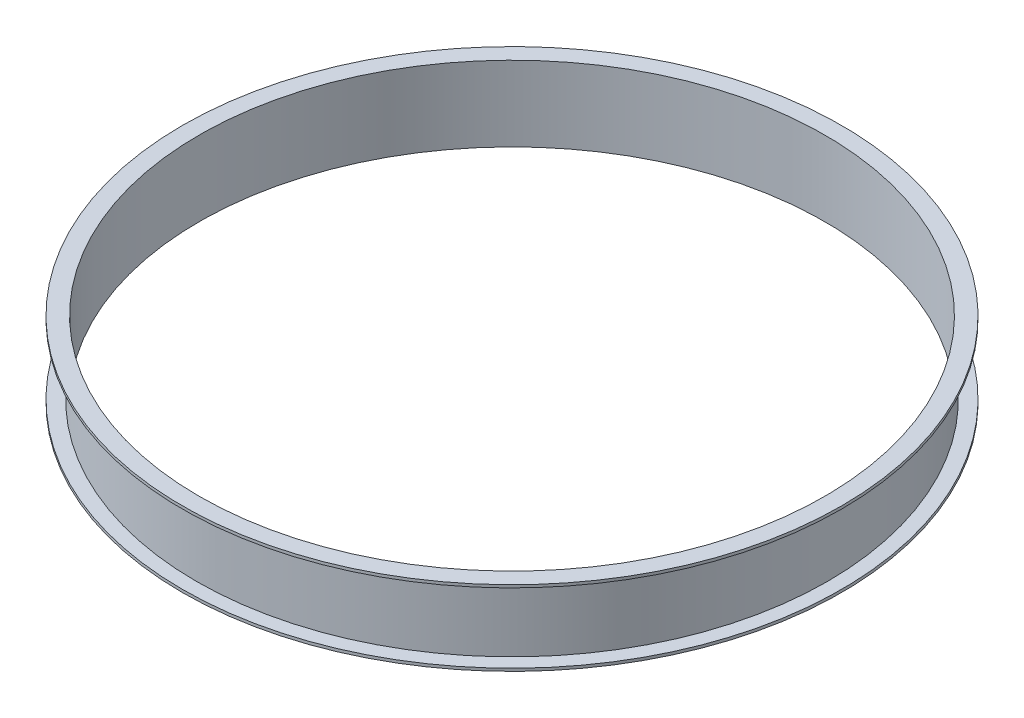
ISO-10303-21;
HEADER;
FILE_DESCRIPTION(('STEP AP214'),'2;1');
FILE_NAME('part.step','',(''),(''),'','','');
FILE_SCHEMA(('AUTOMOTIVE_DESIGN { 1 0 10303 214 1 1 1 1 }'));
ENDSEC;
DATA;
#1=APPLICATION_CONTEXT('core data for automotive mechanical design processes');
#2=APPLICATION_PROTOCOL_DEFINITION('international standard','automotive_design',2000,#1);
#3=PRODUCT_CONTEXT('',#1,'mechanical');
#4=PRODUCT('Part','Part','',(#3));
#5=PRODUCT_RELATED_PRODUCT_CATEGORY('part','',(#4));
#6=PRODUCT_DEFINITION_FORMATION('','',#4);
#7=PRODUCT_DEFINITION_CONTEXT('part definition',#1,'design');
#8=PRODUCT_DEFINITION('design','',#6,#7);
#9=PRODUCT_DEFINITION_SHAPE('','',#8);
#10=(LENGTH_UNIT() NAMED_UNIT(*) SI_UNIT(.MILLI.,.METRE.));
#11=(NAMED_UNIT(*) PLANE_ANGLE_UNIT() SI_UNIT($,.RADIAN.));
#12=(NAMED_UNIT(*) SI_UNIT($,.STERADIAN.) SOLID_ANGLE_UNIT());
#13=UNCERTAINTY_MEASURE_WITH_UNIT(LENGTH_MEASURE(1.E-05),#10,'distance_accuracy_value','');
#14=(GEOMETRIC_REPRESENTATION_CONTEXT(3) GLOBAL_UNCERTAINTY_ASSIGNED_CONTEXT((#13)) GLOBAL_UNIT_ASSIGNED_CONTEXT((#10,
#11,#12)) REPRESENTATION_CONTEXT('',''));
#15=CARTESIAN_POINT('',(0.,0.,0.));
#16=DIRECTION('',(0.,0.,1.));
#17=DIRECTION('',(1.,0.,0.));
#18=AXIS2_PLACEMENT_3D('',#15,#16,#17);
#19=CARTESIAN_POINT('',(0.,2.,0.));
#20=DIRECTION('',(0.,1.,0.));
#21=DIRECTION('',(0.,0.,1.));
#22=AXIS2_PLACEMENT_3D('',#19,#20,#21);
#23=PLANE('',#22);
#24=CARTESIAN_POINT('',(0.,2.,0.));
#25=DIRECTION('',(0.,1.,0.));
#26=DIRECTION('',(0.,0.,1.));
#27=AXIS2_PLACEMENT_3D('',#24,#25,#26);
#28=CIRCLE('',#27,237.);
#29=CARTESIAN_POINT('',(0.,2.,237.));
#30=VERTEX_POINT('',#29);
#31=EDGE_CURVE('E11',#30,#30,#28,.T.);
#32=ORIENTED_EDGE('',*,*,#31,.T.);
#33=EDGE_LOOP('',(#32));
#34=FACE_BOUND('',#33,.T.);
#35=CARTESIAN_POINT('',(0.,2.,0.));
#36=DIRECTION('',(0.,1.,0.));
#37=DIRECTION('',(1.,0.,0.));
#38=AXIS2_PLACEMENT_3D('',#35,#36,#37);
#39=CIRCLE('',#38,227.);
#40=CARTESIAN_POINT('',(227.,2.,0.));
#41=VERTEX_POINT('',#40);
#42=EDGE_CURVE('E60',#41,#41,#39,.T.);
#43=ORIENTED_EDGE('',*,*,#42,.F.);
#44=EDGE_LOOP('',(#43));
#45=FACE_BOUND('',#44,.T.);
#46=ADVANCED_FACE('F44',(#34,#45),#23,.T.);
#47=CARTESIAN_POINT('',(0.,0.,0.));
#48=DIRECTION('',(0.,1.,0.));
#49=DIRECTION('',(0.,0.,1.));
#50=AXIS2_PLACEMENT_3D('',#47,#48,#49);
#51=PLANE('',#50);
#52=CARTESIAN_POINT('',(0.,0.,0.));
#53=DIRECTION('',(0.,1.,0.));
#54=DIRECTION('',(0.,0.,1.));
#55=AXIS2_PLACEMENT_3D('',#52,#53,#54);
#56=CIRCLE('',#55,237.);
#57=CARTESIAN_POINT('',(0.,0.,237.));
#58=VERTEX_POINT('',#57);
#59=EDGE_CURVE('E48',#58,#58,#56,.T.);
#60=ORIENTED_EDGE('',*,*,#59,.F.);
#61=EDGE_LOOP('',(#60));
#62=FACE_BOUND('',#61,.T.);
#63=CARTESIAN_POINT('',(0.,0.,0.));
#64=DIRECTION('',(0.,1.,0.));
#65=DIRECTION('',(0.,0.,1.));
#66=AXIS2_PLACEMENT_3D('',#63,#64,#65);
#67=CIRCLE('',#66,225.);
#68=CARTESIAN_POINT('',(0.,0.,225.));
#69=VERTEX_POINT('',#68);
#70=EDGE_CURVE('E55',#69,#69,#67,.T.);
#71=ORIENTED_EDGE('',*,*,#70,.T.);
#72=EDGE_LOOP('',(#71));
#73=FACE_BOUND('',#72,.T.);
#74=ADVANCED_FACE('F93',(#62,#73),#51,.F.);
#75=CARTESIAN_POINT('',(0.,2.,0.));
#76=DIRECTION('',(0.,-1.,0.));
#77=DIRECTION('',(0.,0.,-1.));
#78=AXIS2_PLACEMENT_3D('',#75,#76,#77);
#79=CYLINDRICAL_SURFACE('',#78,237.);
#80=ORIENTED_EDGE('',*,*,#31,.F.);
#81=EDGE_LOOP('',(#80));
#82=FACE_BOUND('',#81,.T.);
#83=ORIENTED_EDGE('',*,*,#59,.T.);
#84=EDGE_LOOP('',(#83));
#85=FACE_BOUND('',#84,.T.);
#86=ADVANCED_FACE('F46',(#82,#85),#79,.T.);
#87=CARTESIAN_POINT('',(0.,2.,0.));
#88=DIRECTION('',(0.,-1.,0.));
#89=DIRECTION('',(0.,0.,-1.));
#90=AXIS2_PLACEMENT_3D('',#87,#88,#89);
#91=CYLINDRICAL_SURFACE('',#90,225.);
#92=ORIENTED_EDGE('',*,*,#70,.F.);
#93=EDGE_LOOP('',(#92));
#94=FACE_BOUND('',#93,.T.);
#95=CARTESIAN_POINT('',(0.,54.,0.));
#96=DIRECTION('',(0.,1.,0.));
#97=DIRECTION('',(0.,0.,1.));
#98=AXIS2_PLACEMENT_3D('',#95,#96,#97);
#99=CIRCLE('',#98,225.);
#100=CARTESIAN_POINT('',(0.,54.,225.));
#101=VERTEX_POINT('',#100);
#102=EDGE_CURVE('E69',#101,#101,#99,.T.);
#103=ORIENTED_EDGE('',*,*,#102,.T.);
#104=EDGE_LOOP('',(#103));
#105=FACE_BOUND('',#104,.T.);
#106=ADVANCED_FACE('F75',(#94,#105),#91,.F.);
#107=CARTESIAN_POINT('',(0.,52.,0.));
#108=DIRECTION('',(0.,-1.,0.));
#109=DIRECTION('',(0.,0.,-1.));
#110=AXIS2_PLACEMENT_3D('',#107,#108,#109);
#111=CYLINDRICAL_SURFACE('',#110,227.);
#112=CARTESIAN_POINT('',(0.,52.,0.));
#113=DIRECTION('',(0.,1.,0.));
#114=DIRECTION('',(1.,0.,0.));
#115=AXIS2_PLACEMENT_3D('',#112,#113,#114);
#116=CIRCLE('',#115,227.);
#117=CARTESIAN_POINT('',(227.,52.,0.));
#118=VERTEX_POINT('',#117);
#119=EDGE_CURVE('E59',#118,#118,#116,.T.);
#120=ORIENTED_EDGE('',*,*,#119,.F.);
#121=EDGE_LOOP('',(#120));
#122=FACE_BOUND('',#121,.T.);
#123=ORIENTED_EDGE('',*,*,#42,.T.);
#124=EDGE_LOOP('',(#123));
#125=FACE_BOUND('',#124,.T.);
#126=ADVANCED_FACE('F80',(#122,#125),#111,.T.);
#127=CARTESIAN_POINT('',(0.,54.,0.));
#128=DIRECTION('',(0.,1.,0.));
#129=DIRECTION('',(0.,0.,1.));
#130=AXIS2_PLACEMENT_3D('',#127,#128,#129);
#131=PLANE('',#130);
#132=CARTESIAN_POINT('',(0.,54.,0.));
#133=DIRECTION('',(0.,1.,0.));
#134=DIRECTION('',(1.,0.,0.));
#135=AXIS2_PLACEMENT_3D('',#132,#133,#134);
#136=CIRCLE('',#135,237.);
#137=CARTESIAN_POINT('',(237.,54.,0.));
#138=VERTEX_POINT('',#137);
#139=EDGE_CURVE('E63',#138,#138,#136,.T.);
#140=ORIENTED_EDGE('',*,*,#139,.T.);
#141=EDGE_LOOP('',(#140));
#142=FACE_BOUND('',#141,.T.);
#143=ORIENTED_EDGE('',*,*,#102,.F.);
#144=EDGE_LOOP('',(#143));
#145=FACE_BOUND('',#144,.T.);
#146=ADVANCED_FACE('F77',(#142,#145),#131,.T.);
#147=CARTESIAN_POINT('',(0.,52.,0.));
#148=DIRECTION('',(0.,1.,0.));
#149=DIRECTION('',(0.,0.,1.));
#150=AXIS2_PLACEMENT_3D('',#147,#148,#149);
#151=PLANE('',#150);
#152=ORIENTED_EDGE('',*,*,#119,.T.);
#153=EDGE_LOOP('',(#152));
#154=FACE_BOUND('',#153,.T.);
#155=CARTESIAN_POINT('',(0.,52.,0.));
#156=DIRECTION('',(0.,1.,0.));
#157=DIRECTION('',(1.,0.,0.));
#158=AXIS2_PLACEMENT_3D('',#155,#156,#157);
#159=CIRCLE('',#158,237.);
#160=CARTESIAN_POINT('',(237.,52.,0.));
#161=VERTEX_POINT('',#160);
#162=EDGE_CURVE('E66',#161,#161,#159,.T.);
#163=ORIENTED_EDGE('',*,*,#162,.F.);
#164=EDGE_LOOP('',(#163));
#165=FACE_BOUND('',#164,.T.);
#166=ADVANCED_FACE('F79',(#154,#165),#151,.F.);
#167=CARTESIAN_POINT('',(0.,54.,0.));
#168=DIRECTION('',(0.,-1.,0.));
#169=DIRECTION('',(0.,0.,-1.));
#170=AXIS2_PLACEMENT_3D('',#167,#168,#169);
#171=CYLINDRICAL_SURFACE('',#170,237.);
#172=ORIENTED_EDGE('',*,*,#139,.F.);
#173=EDGE_LOOP('',(#172));
#174=FACE_BOUND('',#173,.T.);
#175=ORIENTED_EDGE('',*,*,#162,.T.);
#176=EDGE_LOOP('',(#175));
#177=FACE_BOUND('',#176,.T.);
#178=ADVANCED_FACE('F87',(#174,#177),#171,.T.);
#179=CLOSED_SHELL('',(#46,#74,#86,#106,#126,#146,#166,#178));
#180=MANIFOLD_SOLID_BREP('B2',#179);
#181=ADVANCED_BREP_SHAPE_REPRESENTATION('',(#18,#180),#14);
#182=SHAPE_DEFINITION_REPRESENTATION(#9,#181);
ENDSEC;
END-ISO-10303-21;
